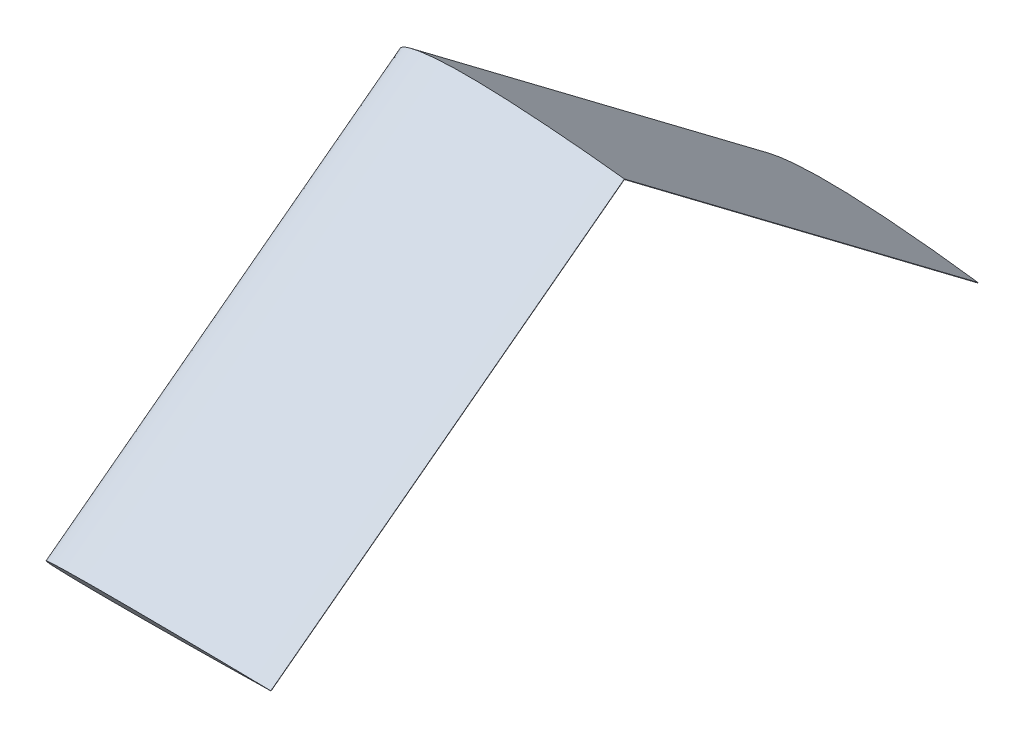
ISO-10303-21;
HEADER;
FILE_DESCRIPTION(('STEP AP214'),'2;1');
FILE_NAME('part.step','',(''),(''),'','','');
FILE_SCHEMA(('AUTOMOTIVE_DESIGN { 1 0 10303 214 1 1 1 1 }'));
ENDSEC;
DATA;
#1=APPLICATION_CONTEXT('core data for automotive mechanical design processes');
#2=APPLICATION_PROTOCOL_DEFINITION('international standard','automotive_design',2000,#1);
#3=PRODUCT_CONTEXT('',#1,'mechanical');
#4=PRODUCT('Part','Part','',(#3));
#5=PRODUCT_RELATED_PRODUCT_CATEGORY('part','',(#4));
#6=PRODUCT_DEFINITION_FORMATION('','',#4);
#7=PRODUCT_DEFINITION_CONTEXT('part definition',#1,'design');
#8=PRODUCT_DEFINITION('design','',#6,#7);
#9=PRODUCT_DEFINITION_SHAPE('','',#8);
#10=(LENGTH_UNIT() NAMED_UNIT(*) SI_UNIT(.MILLI.,.METRE.));
#11=(NAMED_UNIT(*) PLANE_ANGLE_UNIT() SI_UNIT($,.RADIAN.));
#12=(NAMED_UNIT(*) SI_UNIT($,.STERADIAN.) SOLID_ANGLE_UNIT());
#13=UNCERTAINTY_MEASURE_WITH_UNIT(LENGTH_MEASURE(1.E-05),#10,'distance_accuracy_value','');
#14=(GEOMETRIC_REPRESENTATION_CONTEXT(3) GLOBAL_UNCERTAINTY_ASSIGNED_CONTEXT((#13)) GLOBAL_UNIT_ASSIGNED_CONTEXT((#10,
#11,#12)) REPRESENTATION_CONTEXT('',''));
#15=CARTESIAN_POINT('',(0.,0.,0.));
#16=DIRECTION('',(0.,0.,1.));
#17=DIRECTION('',(1.,0.,0.));
#18=AXIS2_PLACEMENT_3D('',#15,#16,#17);
#19=CARTESIAN_POINT('',(143.952602362274,-161.848092926006,378.892977336685));
#20=CARTESIAN_POINT('',(140.61957999214,-161.604115399992,379.076827589547));
#21=CARTESIAN_POINT('',(133.954991813125,-161.116266968375,379.444447751029));
#22=CARTESIAN_POINT('',(120.62372160465,-160.207856944438,380.128983803721));
#23=CARTESIAN_POINT('',(103.959189074714,-159.165298958326,380.914607596622));
#24=CARTESIAN_POINT('',(83.9586002291853,-158.056392438793,381.750228595601));
#25=CARTESIAN_POINT('',(63.9588116130858,-157.091822782139,382.477083966979));
#26=CARTESIAN_POINT('',(43.9586195633446,-156.308534669504,383.067333896653));
#27=CARTESIAN_POINT('',(23.9577994776588,-155.748200364287,383.489576081761));
#28=CARTESIAN_POINT('',(3.95194559722353,-155.513754885242,383.666243422023));
#29=CARTESIAN_POINT('',(-12.7217349486802,-155.70661131207,383.520915680499));
#30=CARTESIAN_POINT('',(-26.0606713748085,-156.244088382626,383.115897657144));
#31=CARTESIAN_POINT('',(-34.3930295079639,-156.810856651528,382.688807132643));
#32=CARTESIAN_POINT('',(-41.0692888617203,-157.487508912649,382.178913080764));
#33=CARTESIAN_POINT('',(-46.0602083374664,-158.142946372311,381.685005528447));
#34=CARTESIAN_POINT('',(-50.3481449580584,-158.998680431969,381.040163661981));
#35=CARTESIAN_POINT('',(-53.7165706322389,-159.872289036431,380.381852359884));
#36=CARTESIAN_POINT('',(-57.3766252059797,-161.982263691694,378.791872412796));
#37=CARTESIAN_POINT('',(-53.7165706322388,-164.092238346958,377.201892465707));
#38=CARTESIAN_POINT('',(-50.3481449580584,-164.96584695142,376.54358116361));
#39=CARTESIAN_POINT('',(-46.0602083374664,-165.821581011078,375.898739297144));
#40=CARTESIAN_POINT('',(-41.0692888617202,-166.477018470739,375.404831744827));
#41=CARTESIAN_POINT('',(-34.393029507964,-167.15367073186,374.894937692948));
#42=CARTESIAN_POINT('',(-26.0606713748085,-167.720439000762,374.467847168448));
#43=CARTESIAN_POINT('',(-12.7217349486803,-168.257916071319,374.062829145092));
#44=CARTESIAN_POINT('',(3.95194559722356,-168.450772498147,373.917501403568));
#45=CARTESIAN_POINT('',(23.9577994776588,-168.216327019102,374.09416874383));
#46=CARTESIAN_POINT('',(43.9586195633446,-167.655992713885,374.516410928938));
#47=CARTESIAN_POINT('',(63.9588116130858,-166.87270460125,375.106660858612));
#48=CARTESIAN_POINT('',(83.9586002291853,-165.908134944596,375.83351622999));
#49=CARTESIAN_POINT('',(103.959189074714,-164.799228425063,376.669137228969));
#50=CARTESIAN_POINT('',(120.62372160465,-163.756670438951,377.45476102187));
#51=CARTESIAN_POINT('',(133.954991813125,-162.848260415014,378.139297074562));
#52=CARTESIAN_POINT('',(140.61957999214,-162.360411983396,378.506917236044));
#53=CARTESIAN_POINT('',(143.952602362274,-162.116434457382,378.690767488906));
#54=B_SPLINE_CURVE_WITH_KNOTS('',3,(#19,#20,#21,#22,#23,#24,#25,#26,#27,#28,#29,#30,#31,#32,#33,
#34,#35,#36,#37,#38,#39,#40,#41,#42,#43,#44,#45,#46,#47,#48,#49,#50,#51,#52,#53),.UNSPECIFIED.,
.F.,.F.,(4,1,1,1,1,1,1,1,1,1,1,1,1,1,1,1,1,1,1,1,1,1,1,1,1,1,1,1,1,1,1,1,4),(0.,
0.0248762929189861,0.0497417146704997,0.099443402111095,0.149112224036195,0.198750974066913,
0.248359097492202,0.297937369716024,0.347491327096237,0.39705092368842,0.421859474838904,
0.446731345826761,0.459220451479858,0.471790601601357,0.484560454432956,0.491195112481227,0.5,
0.508804887518773,0.515439545567044,0.528209398398643,0.540779548520142,0.553268654173239,
0.578140525161096,0.60294907631158,0.652508672903763,0.702062630283976,0.751640902507798,
0.801249025933087,0.850887775963805,0.900556597888905,0.9502582853295,0.975123707081014,1.),.UNSPECIFIED.);
#55=DIRECTION('',(0.,0.601815023152049,-0.798635510047292));
#56=VECTOR('',#55,1.);
#57=SURFACE_OF_LINEAR_EXTRUSION('',#54,#56);
#58=DIRECTION('',(0.,0.601815023152049,-0.798635510047292));
#59=VECTOR('',#58,1.);
#60=CARTESIAN_POINT('',(143.952602362274,-161.848092926006,378.892977336685));
#61=LINE('',#60,#59);
#62=CARTESIAN_POINT('',(143.952602362274,-161.848092926006,378.892977336685));
#63=VERTEX_POINT('',#62);
#64=CARTESIAN_POINT('',(143.952602362274,75.3250829326901,64.153542486136));
#65=VERTEX_POINT('',#64);
#66=EDGE_CURVE('E45',#63,#65,#61,.T.);
#67=ORIENTED_EDGE('',*,*,#66,.T.);
#68=CARTESIAN_POINT('',(143.952602362274,75.3250829326901,64.153542486136));
#69=CARTESIAN_POINT('',(143.091504842635,75.4239090445904,64.153542486136));
#70=CARTESIAN_POINT('',(142.230406919768,75.5227334980247,64.153542486136));
#71=CARTESIAN_POINT('',(140.508157930398,75.7199322641916,64.153542486136));
#72=CARTESIAN_POINT('',(139.647006863799,75.8183065760767,64.153542486136));
#73=CARTESIAN_POINT('',(137.924602775179,76.0141578276672,64.153542486136));
#74=CARTESIAN_POINT('',(137.063349753193,76.1116347676696,64.153542486136));
#75=CARTESIAN_POINT('',(135.340690800568,76.3052232311979,64.153542486136));
#76=CARTESIAN_POINT('',(134.479284870057,76.4013347558591,64.153542486136));
#77=CARTESIAN_POINT('',(131.892725055203,76.6872706822147,64.153542486136));
#78=CARTESIAN_POINT('',(130.167279474345,76.874461337291,64.153542486136));
#79=CARTESIAN_POINT('',(126.715755907748,77.24289792046,64.153542486136));
#80=CARTESIAN_POINT('',(124.989677922064,77.4241438490792,64.153542486136));
#81=CARTESIAN_POINT('',(121.535353633618,77.7816932027243,64.153542486136));
#82=CARTESIAN_POINT('',(119.807106828285,77.9579917709669,64.153542486136));
#83=CARTESIAN_POINT('',(116.350098179853,78.3054677751467,64.153542486136));
#84=CARTESIAN_POINT('',(114.621336336655,78.4766452100797,64.153542486136));
#85=CARTESIAN_POINT('',(111.162096219548,78.8140637137569,64.153542486136));
#86=CARTESIAN_POINT('',(109.431617596559,78.9803012046796,64.153542486136));
#87=CARTESIAN_POINT('',(105.970187570763,79.3077672476626,64.153542486136));
#88=CARTESIAN_POINT('',(104.239236168019,79.468995800409,64.153542486136));
#89=CARTESIAN_POINT('',(99.044099308192,79.9453671176224,64.153542486136));
#90=CARTESIAN_POINT('',(95.5792244273077,80.2530402098719,64.153542486136));
#91=CARTESIAN_POINT('',(90.3802474315717,80.6994746457596,64.153542486136));
#92=CARTESIAN_POINT('',(88.6467895595026,80.8457886414351,64.153542486136));
#93=CARTESIAN_POINT('',(85.1794555059264,81.1333849586469,64.153542486136));
#94=CARTESIAN_POINT('',(83.4455793243787,81.2746672796919,64.153542486136));
#95=CARTESIAN_POINT('',(79.9394818342838,81.5550764273189,64.153542486136));
#96=CARTESIAN_POINT('',(78.1672513455697,81.6940885116319,64.153542486136));
#97=CARTESIAN_POINT('',(74.6223430595246,81.9662921225997,64.153542486136));
#98=CARTESIAN_POINT('',(72.8496652622246,82.0994836496566,64.153542486136));
#99=CARTESIAN_POINT('',(69.3042081426059,82.3596607187556,64.153542486136));
#100=CARTESIAN_POINT('',(67.5314289104969,82.4866474890378,64.153542486136));
#101=CARTESIAN_POINT('',(63.9854135078099,82.7340781184585,64.153542486136));
#102=CARTESIAN_POINT('',(62.2121773372542,82.8545219779159,64.153542486136));
#103=CARTESIAN_POINT('',(58.6659397194216,83.0884204192505,64.153542486136));
#104=CARTESIAN_POINT('',(56.8929384513298,83.2018777147307,64.153542486136));
#105=CARTESIAN_POINT('',(53.3464795567983,83.4214372461215,64.153542486136));
#106=CARTESIAN_POINT('',(51.5730219302596,83.5275394804364,64.153542486136));
#107=CARTESIAN_POINT('',(48.0266555121979,83.7319077705604,64.153542486136));
#108=CARTESIAN_POINT('',(46.2537469729836,83.8301782000895,64.153542486136));
#109=CARTESIAN_POINT('',(42.7074960717293,84.0185645962361,64.153542486136));
#110=CARTESIAN_POINT('',(40.9341537097865,84.1086805646786,64.153542486136));
#111=CARTESIAN_POINT('',(37.3882707735612,84.2797230785456,64.153542486136));
#112=CARTESIAN_POINT('',(35.6157305093444,84.3606560252196,64.153542486136));
#113=CARTESIAN_POINT('',(32.0702120413599,84.5123718261132,64.153542486136));
#114=CARTESIAN_POINT('',(30.2972338371881,84.5831546709358,64.153542486136));
#115=CARTESIAN_POINT('',(26.7522354834228,84.71351280535,64.153542486136));
#116=CARTESIAN_POINT('',(24.9802156522872,84.7730967137726,64.153542486136));
#117=CARTESIAN_POINT('',(21.4358113814512,84.8800667513362,64.153542486136));
#118=CARTESIAN_POINT('',(19.6634269431417,84.9274529261755,64.153542486136));
#119=CARTESIAN_POINT('',(16.1301031642667,85.0083539719661,64.153542486136));
#120=CARTESIAN_POINT('',(14.3691659005415,85.0419587808441,64.153542486136));
#121=CARTESIAN_POINT('',(10.8469376379321,85.0944052089932,64.153542486136));
#122=CARTESIAN_POINT('',(9.08564662269794,85.1132457637078,64.153542486136));
#123=CARTESIAN_POINT('',(6.44316283663508,85.1294075319724,64.153542486136));
#124=CARTESIAN_POINT('',(5.56200423064849,85.1327775476692,64.153542486136));
#125=CARTESIAN_POINT('',(3.79968018386539,85.1353278281197,64.153542486136));
#126=CARTESIAN_POINT('',(2.91851474306882,85.1345080928318,64.153542486136));
#127=CARTESIAN_POINT('',(1.15528851349806,85.1283619546332,64.153542486136));
#128=CARTESIAN_POINT('',(0.273227739822705,85.1230308986157,64.153542486136));
#129=CARTESIAN_POINT('',(-1.49084911613677,85.1074831447258,64.153542486136));
#130=CARTESIAN_POINT('',(-2.37286519842429,85.097266447226,64.153542486136));
#131=CARTESIAN_POINT('',(-5.0215640126559,85.0587090559856,64.153542486136));
#132=CARTESIAN_POINT('',(-6.7881456363967,85.0224683668577,64.153542486136));
#133=CARTESIAN_POINT('',(-9.43941992083861,84.9501005715352,64.153542486136));
#134=CARTESIAN_POINT('',(-10.3243647828136,84.9229378826865,64.153542486136));
#135=CARTESIAN_POINT('',(-12.0940388078164,84.8622349551788,64.153542486136));
#136=CARTESIAN_POINT('',(-12.9787679706973,84.828694712187,64.153542486136));
#137=CARTESIAN_POINT('',(-14.7477165068682,84.7549012254339,64.153542486136));
#138=CARTESIAN_POINT('',(-15.6319359528791,84.7146497270809,64.153542486136));
#139=CARTESIAN_POINT('',(-17.4000227725327,84.6270046362215,64.153542486136));
#140=CARTESIAN_POINT('',(-18.2838901462076,84.5796110443714,64.153542486136));
#141=CARTESIAN_POINT('',(-20.0515146071349,84.476815943843,64.153542486136));
#142=CARTESIAN_POINT('',(-20.9352715100331,84.421411251097,64.153542486136));
#143=CARTESIAN_POINT('',(-22.7021939728894,84.3018110382037,64.153542486136));
#144=CARTESIAN_POINT('',(-23.5853595335455,84.237615528452,64.153542486136));
#145=CARTESIAN_POINT('',(-24.9090305304399,84.1341589068031,64.153542486136));
#146=CARTESIAN_POINT('',(-25.3498194787281,84.0985022103079,64.153542486136));
#147=CARTESIAN_POINT('',(-26.2311876041704,84.0247013487188,64.153542486136));
#148=CARTESIAN_POINT('',(-26.6717667819209,83.9865571907396,64.153542486136));
#149=CARTESIAN_POINT('',(-27.9931567311891,83.8681219968155,64.153542486136));
#150=CARTESIAN_POINT('',(-28.8736142415541,83.7838286804741,64.153542486136));
#151=CARTESIAN_POINT('',(-30.6311195513557,83.6032487307955,64.153542486136));
#152=CARTESIAN_POINT('',(-31.5081704169792,83.5069920234199,64.153542486136));
#153=CARTESIAN_POINT('',(-33.2606722816216,83.3008283693725,64.153542486136));
#154=CARTESIAN_POINT('',(-34.1361232953858,83.1909215491587,64.153542486136));
#155=CARTESIAN_POINT('',(-35.4463391850807,83.014940385316,64.153542486136));
#156=CARTESIAN_POINT('',(-35.8818704403477,82.9545349484617,64.153542486136));
#157=CARTESIAN_POINT('',(-36.7523664925758,82.8297836602434,64.153542486136));
#158=CARTESIAN_POINT('',(-37.1873312941877,82.7654378414425,64.153542486136));
#159=CARTESIAN_POINT('',(-38.0566705767303,82.6324752162049,64.153542486136));
#160=CARTESIAN_POINT('',(-38.4910449663368,82.5638578121717,64.153542486136));
#161=CARTESIAN_POINT('',(-39.3590511630824,82.4220494422724,64.153542486136));
#162=CARTESIAN_POINT('',(-39.7926829664721,82.3488584533833,64.153542486136));
#163=CARTESIAN_POINT('',(-40.4419600264255,82.2354791516525,64.153542486136));
#164=CARTESIAN_POINT('',(-40.6579285553256,82.1971360732949,64.153542486136));
#165=CARTESIAN_POINT('',(-41.0896403279291,82.11920247366,64.153542486136));
#166=CARTESIAN_POINT('',(-41.3053835714709,82.079611951488,64.153542486136));
#167=CARTESIAN_POINT('',(-41.9522212540842,81.9587053097464,64.153542486136));
#168=CARTESIAN_POINT('',(-42.3829211672392,81.8752545443628,64.153542486136));
#169=CARTESIAN_POINT('',(-43.2427340032819,81.7010252338525,64.153542486136));
#170=CARTESIAN_POINT('',(-43.6718472883149,81.6102484846794,64.153542486136));
#171=CARTESIAN_POINT('',(-44.5281024795138,81.4198685770225,64.153542486136));
#172=CARTESIAN_POINT('',(-44.9552444904368,81.3202658933828,64.153542486136));
#173=CARTESIAN_POINT('',(-45.6391089420976,81.1521773026259,64.153542486136));
#174=CARTESIAN_POINT('',(-45.8966234787967,81.0869062477102,64.153542486136));
#175=CARTESIAN_POINT('',(-46.4107356127852,80.9523994835194,64.153542486136));
#176=CARTESIAN_POINT('',(-46.6673327639319,80.8831620669524,64.153542486136));
#177=CARTESIAN_POINT('',(-47.1796991919164,80.7407931775547,64.153542486136));
#178=CARTESIAN_POINT('',(-47.4354674849489,80.667658166386,64.153542486136));
#179=CARTESIAN_POINT('',(-47.9462419156183,80.5174668715224,64.153542486136));
#180=CARTESIAN_POINT('',(-48.2012464699879,80.4404052038941,64.153542486136));
#181=CARTESIAN_POINT('',(-48.7105457979869,80.2822822225644,64.153542486136));
#182=CARTESIAN_POINT('',(-48.9648383006953,80.2012135838178,64.153542486136));
#183=CARTESIAN_POINT('',(-49.3438296208438,80.0771353414723,64.153542486136));
#184=CARTESIAN_POINT('',(-49.4690181223648,80.0356163290272,64.153542486136));
#185=CARTESIAN_POINT('',(-49.719065641439,79.9515986144812,64.153542486136));
#186=CARTESIAN_POINT('',(-49.8439246605605,79.9090999170527,64.153542486136));
#187=CARTESIAN_POINT('',(-50.0933140180802,79.8231005409698,64.153542486136));
#188=CARTESIAN_POINT('',(-50.2178443149123,79.7795997417871,64.153542486136));
#189=CARTESIAN_POINT('',(-50.4665429612923,79.6915715654654,64.153542486136));
#190=CARTESIAN_POINT('',(-50.5907113077087,79.6470441794744,64.153542486136));
#191=CARTESIAN_POINT('',(-50.838488493365,79.557025770829,64.153542486136));
#192=CARTESIAN_POINT('',(-50.9620978904113,79.5115362817313,64.153542486136));
#193=CARTESIAN_POINT('',(-51.2088933948002,79.4194101874438,64.153542486136));
#194=CARTESIAN_POINT('',(-51.3320794958394,79.3727735652553,64.153542486136));
#195=CARTESIAN_POINT('',(-51.5772200896587,79.2772991006177,64.153542486136));
#196=CARTESIAN_POINT('',(-51.6991770144063,79.2284675616305,64.153542486136));
#197=CARTESIAN_POINT('',(-51.9417300550992,79.1275257413686,64.153542486136));
#198=CARTESIAN_POINT('',(-52.0623262228257,79.0754155853555,64.153542486136));
#199=CARTESIAN_POINT('',(-52.3015742602238,78.9672378121424,64.153542486136));
#200=CARTESIAN_POINT('',(-52.4202281961954,78.9111747901135,64.153542486136));
#201=CARTESIAN_POINT('',(-52.6553352785154,78.7946180996915,64.153542486136));
#202=CARTESIAN_POINT('',(-52.7717885034972,78.7341245899818,64.153542486136));
#203=CARTESIAN_POINT('',(-53.0432741183173,78.5861694054344,64.153542486136));
#204=CARTESIAN_POINT('',(-53.1972644111348,78.4967801151391,64.153542486136));
#205=CARTESIAN_POINT('',(-53.4245390220594,78.3566098003706,64.153542486136));
#206=CARTESIAN_POINT('',(-53.4997078690134,78.3088517883278,64.153542486136));
#207=CARTESIAN_POINT('',(-53.6487865953405,78.2114051395005,64.153542486136));
#208=CARTESIAN_POINT('',(-53.7226964426265,78.1617164536158,64.153542486136));
#209=CARTESIAN_POINT('',(-53.9425968225125,78.0096658829484,64.153542486136));
#210=CARTESIAN_POINT('',(-54.0866055110525,77.9044136526297,64.153542486136));
#211=CARTESIAN_POINT('',(-54.3683227215342,77.6858576662072,64.153542486136));
#212=CARTESIAN_POINT('',(-54.5060338122773,77.5725572420082,64.153542486136));
#213=CARTESIAN_POINT('',(-54.7292462225555,77.3759016300992,64.153542486136));
#214=CARTESIAN_POINT('',(-54.8169460072559,77.2950423289404,64.153542486136));
#215=CARTESIAN_POINT('',(-54.9879968191381,77.1288606370401,64.153542486136));
#216=CARTESIAN_POINT('',(-55.0713488772023,77.0435393139781,64.153542486136));
#217=CARTESIAN_POINT('',(-55.2325130662353,76.8680416722088,64.153542486136));
#218=CARTESIAN_POINT('',(-55.3103341947127,76.7778736780924,64.153542486136));
#219=CARTESIAN_POINT('',(-55.4589945860398,76.591999924668,64.153542486136));
#220=CARTESIAN_POINT('',(-55.5298383982001,76.4962978391533,64.1535424861359));
#221=CARTESIAN_POINT('',(-55.6673894410979,76.2911841540217,64.1535424861359));
#222=CARTESIAN_POINT('',(-55.7333797329425,76.1812830521377,64.153542486136));
#223=CARTESIAN_POINT('',(-55.8506517045267,75.9537794715797,64.153542486136));
#224=CARTESIAN_POINT('',(-55.9019454040337,75.8361833835933,64.153542486136));
#225=CARTESIAN_POINT('',(-55.97597620075,75.6175041982206,64.153542486136));
#226=CARTESIAN_POINT('',(-56.0023376737124,75.517694375028,64.153542486136));
#227=CARTESIAN_POINT('',(-56.0292393607463,75.3658823664578,64.153542486136));
#228=CARTESIAN_POINT('',(-56.0360993443303,75.3149742914742,64.153542486136));
#229=CARTESIAN_POINT('',(-56.0452464387317,75.2127432516913,64.153542486136));
#230=CARTESIAN_POINT('',(-56.047534613886,75.1614203862513,64.1535424861359));
#231=CARTESIAN_POINT('',(-56.0472471580087,75.0586428490093,64.1535424861359));
#232=CARTESIAN_POINT('',(-56.044657750578,75.0071882150238,64.153542486136));
#233=CARTESIAN_POINT('',(-56.0349070915986,74.9047043673854,64.153542486136));
#234=CARTESIAN_POINT('',(-56.0277431853434,74.8536754182007,64.153542486136));
#235=CARTESIAN_POINT('',(-55.9999332346724,74.701551415175,64.153542486136));
#236=CARTESIAN_POINT('',(-55.9729715125178,74.6015728539683,64.153542486136));
#237=CARTESIAN_POINT('',(-55.9138451416059,74.429710457099,64.153542486136));
#238=CARTESIAN_POINT('',(-55.8844567812057,74.3568149306114,64.153542486136));
#239=CARTESIAN_POINT('',(-55.8193890129286,74.2138438015702,64.153542486136));
#240=CARTESIAN_POINT('',(-55.783705936014,74.1437698730767,64.153542486136));
#241=CARTESIAN_POINT('',(-55.7071345748009,74.0063304484578,64.153542486136));
#242=CARTESIAN_POINT('',(-55.6662334453048,73.9389721949748,64.153542486136));
#243=CARTESIAN_POINT('',(-55.5802154269054,73.8069935869013,64.153542486136));
#244=CARTESIAN_POINT('',(-55.5350972130566,73.7423741021225,64.153542486136));
#245=CARTESIAN_POINT('',(-55.4259688141894,73.5948744101349,64.153542486136));
#246=CARTESIAN_POINT('',(-55.3606271294481,73.512981617898,64.153542486136));
#247=CARTESIAN_POINT('',(-55.2250599278193,73.3532699386011,64.153542486136));
#248=CARTESIAN_POINT('',(-55.1548305324397,73.2754543747312,64.153542486136));
#249=CARTESIAN_POINT('',(-55.0104384484415,73.1235437920001,64.153542486136));
#250=CARTESIAN_POINT('',(-54.9362748147799,73.0494496754648,64.153542486136));
#251=CARTESIAN_POINT('',(-54.7847212505564,72.9046737505047,64.153542486136));
#252=CARTESIAN_POINT('',(-54.70733176029,72.8339914792226,64.153542486136));
#253=CARTESIAN_POINT('',(-54.5498472181498,72.6957780960501,64.153542486136));
#254=CARTESIAN_POINT('',(-54.469753194931,72.6282458088427,64.1535424861359));
#255=CARTESIAN_POINT('',(-54.3071736296893,72.4960670665234,64.153542486136));
#256=CARTESIAN_POINT('',(-54.2246871747985,72.4314217375174,64.1535424861361));
#257=CARTESIAN_POINT('',(-54.0277447705784,72.2822602123031,64.1535424861361));
#258=CARTESIAN_POINT('',(-53.9124068877257,72.1989070151379,64.153542486136));
#259=CARTESIAN_POINT('',(-53.6783189366077,72.0370474173846,64.1535424861359));
#260=CARTESIAN_POINT('',(-53.5595675314954,71.9585429546857,64.153542486136));
#261=CARTESIAN_POINT('',(-53.3189031160552,71.8065972069062,64.153542486136));
#262=CARTESIAN_POINT('',(-53.1969908603278,71.7331547284023,64.153542486136));
#263=CARTESIAN_POINT('',(-52.9501994875512,71.5916812992463,64.153542486136));
#264=CARTESIAN_POINT('',(-52.8253229142801,71.5236459121309,64.153542486136));
#265=CARTESIAN_POINT('',(-52.5723612527515,71.3926647537397,64.153542486136));
#266=CARTESIAN_POINT('',(-52.4442661996192,71.3297382657053,64.153542486136));
#267=CARTESIAN_POINT('',(-52.1857471877617,71.2088570348012,64.153542486136));
#268=CARTESIAN_POINT('',(-52.0553230057184,71.1509027717969,64.153542486136));
#269=CARTESIAN_POINT('',(-51.7926212526764,71.0391158024678,64.153542486136));
#270=CARTESIAN_POINT('',(-51.6603424072996,70.9852861127765,64.153542486136));
#271=CARTESIAN_POINT('',(-51.4610161511027,70.9067527176867,64.153542486136));
#272=CARTESIAN_POINT('',(-51.3944019068255,70.8809357691287,64.153542486136));
#273=CARTESIAN_POINT('',(-51.2609532617509,70.8298741081267,64.153542486136));
#274=CARTESIAN_POINT('',(-51.1941188578632,70.8046294037545,64.153542486136));
#275=CARTESIAN_POINT('',(-51.0506071504989,70.7508756197378,64.153542486136));
#276=CARTESIAN_POINT('',(-50.9739083276988,70.7224241915159,64.153542486136));
#277=CARTESIAN_POINT('',(-50.8203654775441,70.6659156372095,64.153542486136));
#278=CARTESIAN_POINT('',(-50.7435214500409,70.6378585115292,64.153542486136));
#279=CARTESIAN_POINT('',(-50.5127687025046,70.5542938409144,64.153542486136));
#280=CARTESIAN_POINT('',(-50.3586400331744,70.4993932701514,64.153542486136));
#281=CARTESIAN_POINT('',(-49.8954262112763,70.3370179014985,64.153542486136));
#282=CARTESIAN_POINT('',(-49.5855218043469,70.2318726424985,64.153542486136));
#283=CARTESIAN_POINT('',(-48.9637534995057,70.0275190322083,64.153542486136));
#284=CARTESIAN_POINT('',(-48.6518895310898,69.9283108959005,64.153542486136));
#285=CARTESIAN_POINT('',(-48.0263758060117,69.735689794795,64.153542486136));
#286=CARTESIAN_POINT('',(-47.7127260393789,69.6422768623879,64.153542486136));
#287=CARTESIAN_POINT('',(-47.0837089158528,69.4612080785802,64.153542486136));
#288=CARTESIAN_POINT('',(-46.7683412746777,69.3735532134557,64.153542486136));
#289=CARTESIAN_POINT('',(-46.2941109883373,69.2464865268156,64.153542486136));
#290=CARTESIAN_POINT('',(-46.1358371551145,69.2048667508384,64.153542486136));
#291=CARTESIAN_POINT('',(-45.8189046683789,69.1231163391731,64.153542486136));
#292=CARTESIAN_POINT('',(-45.6602460133246,69.0829857094605,64.153542486136));
#293=CARTESIAN_POINT('',(-45.1837155140361,68.9647264812723,64.153542486136));
#294=CARTESIAN_POINT('',(-44.8653111229623,68.8887364211902,64.153542486136));
#295=CARTESIAN_POINT('',(-44.227312858038,68.7419427236472,64.153542486136));
#296=CARTESIAN_POINT('',(-43.9077189783501,68.6711391116743,64.153542486136));
#297=CARTESIAN_POINT('',(-43.2662304466943,68.5338427816301,64.153542486136));
#298=CARTESIAN_POINT('',(-42.9443317419105,68.4673690475577,64.153542486136));
#299=CARTESIAN_POINT('',(-42.2997371585009,68.3384190912528,64.153542486136));
#300=CARTESIAN_POINT('',(-41.9770412782564,68.2759428771445,64.153542486136));
#301=CARTESIAN_POINT('',(-41.3311046336845,68.1542688576356,64.153542486136));
#302=CARTESIAN_POINT('',(-41.0078639981014,68.0950703661052,64.153542486136));
#303=CARTESIAN_POINT('',(-40.3608915549719,67.9794288559995,64.153542486136));
#304=CARTESIAN_POINT('',(-40.0371597482664,67.9229858327118,64.153542486136));
#305=CARTESIAN_POINT('',(-39.3892548461898,67.8127801562698,64.153542486136));
#306=CARTESIAN_POINT('',(-39.0650817706884,67.7590173862781,64.153542486136));
#307=CARTESIAN_POINT('',(-38.4163279895494,67.6540197369659,64.153542486136));
#308=CARTESIAN_POINT('',(-38.091747284705,67.6027848527352,64.153542486136));
#309=CARTESIAN_POINT('',(-37.1174795308948,67.4526768669543,64.153542486136));
#310=CARTESIAN_POINT('',(-36.4672373539867,67.3573954426719,64.153542486136));
#311=CARTESIAN_POINT('',(-34.9534250016652,67.1457778828665,64.153542486136));
#312=CARTESIAN_POINT('',(-34.0893998397032,67.032701076912,64.153542486136));
#313=CARTESIAN_POINT('',(-32.3596472069321,66.820321630238,64.153542486136));
#314=CARTESIAN_POINT('',(-31.4939196976698,66.7210193043723,64.153542486136));
#315=CARTESIAN_POINT('',(-29.7610917655512,66.5347569702205,64.153542486136));
#316=CARTESIAN_POINT('',(-28.8939912627879,66.4477977091499,64.153542486136));
#317=CARTESIAN_POINT('',(-27.1587802001027,66.2847363547585,64.153542486136));
#318=CARTESIAN_POINT('',(-26.2906696445434,66.2086342147185,64.153542486136));
#319=CARTESIAN_POINT('',(-24.5532927667184,66.0659226873709,64.153542486136));
#320=CARTESIAN_POINT('',(-23.6840261062775,65.9993174363,64.153542486136));
#321=CARTESIAN_POINT('',(-21.9448640608879,65.8749375689189,64.153542486136));
#322=CARTESIAN_POINT('',(-21.0749686763579,65.8171629467315,64.153542486136));
#323=CARTESIAN_POINT('',(-19.3343242872876,65.7096432620345,64.153542486136));
#324=CARTESIAN_POINT('',(-18.4635750786586,65.6599015208652,64.153542486136));
#325=CARTESIAN_POINT('',(-16.7216940117845,65.567670488203,64.153542486136));
#326=CARTESIAN_POINT('',(-15.8505621531933,65.5251812032829,64.153542486136));
#327=CARTESIAN_POINT('',(-14.1078243829506,65.4468410940983,64.153542486136));
#328=CARTESIAN_POINT('',(-13.2362184110779,65.4109916129892,64.153542486136));
#329=CARTESIAN_POINT('',(-11.4927711398355,65.3456432051477,64.153542486136));
#330=CARTESIAN_POINT('',(-10.6209298407033,65.3161442720325,64.153542486136));
#331=CARTESIAN_POINT('',(-8.00530412011786,65.2366422312909,64.153542486136));
#332=CARTESIAN_POINT('',(-6.26124159708381,65.1956260979165,64.153542486136));
#333=CARTESIAN_POINT('',(-2.77458075541047,65.1348134438956,64.153542486136));
#334=CARTESIAN_POINT('',(-1.03198280552638,65.1149948490044,64.153542486136));
#335=CARTESIAN_POINT('',(1.58165085811895,65.099044536561,64.153542486136));
#336=CARTESIAN_POINT('',(2.45265148575412,65.0960232896794,64.153542486136));
#337=CARTESIAN_POINT('',(4.19465725139902,65.0942041474645,64.153542486136));
#338=CARTESIAN_POINT('',(5.06566238940912,65.0954062524925,64.153542486136));
#339=CARTESIAN_POINT('',(7.67821280527559,65.1050483335209,64.153542486136));
#340=CARTESIAN_POINT('',(9.41973844775483,65.1195216036573,64.153542486136));
#341=CARTESIAN_POINT('',(12.9023320898812,65.1632717344574,64.153542486136));
#342=CARTESIAN_POINT('',(14.6434001188389,65.1925463415707,64.153542486136));
#343=CARTESIAN_POINT('',(18.1251299675441,65.2645904328426,64.153542486136));
#344=CARTESIAN_POINT('',(19.8657918074093,65.3073589541477,64.153542486136));
#345=CARTESIAN_POINT('',(23.346757843303,65.4050504524324,64.1535424861359));
#346=CARTESIAN_POINT('',(25.0870620420052,65.4599733349703,64.1535424861359));
#347=CARTESIAN_POINT('',(28.4638288335067,65.5772653345018,64.1535424861359));
#348=CARTESIAN_POINT('',(30.1003136930728,65.6389976106136,64.1535424861359));
#349=CARTESIAN_POINT('',(33.3729218776215,65.7714519907568,64.153542486136));
#350=CARTESIAN_POINT('',(35.0090452018136,65.8421741142556,64.153542486136));
#351=CARTESIAN_POINT('',(38.2810857660997,65.991819260755,64.153542486136));
#352=CARTESIAN_POINT('',(39.9170029670842,66.0707431355913,64.153542486136));
#353=CARTESIAN_POINT('',(43.1884644940648,66.2359387090841,64.153542486136));
#354=CARTESIAN_POINT('',(44.8240088202162,66.3222104046754,64.153542486136));
#355=CARTESIAN_POINT('',(48.0949407976248,66.5015556195402,64.153542486136));
#356=CARTESIAN_POINT('',(49.7303283996706,66.5946300355259,64.153542486136));
#357=CARTESIAN_POINT('',(53.000718685505,66.7872921554209,64.153542486136));
#358=CARTESIAN_POINT('',(54.6357213693388,66.8868798585646,64.153542486136));
#359=CARTESIAN_POINT('',(59.5405436151687,67.1949253467566,64.153542486136));
#360=CARTESIAN_POINT('',(62.8097845120938,67.4126438138789,64.153542486136));
#361=CARTESIAN_POINT('',(69.3470128145788,67.870252192513,64.153542486136));
#362=CARTESIAN_POINT('',(72.6150000749957,68.110144167564,64.153542486136));
#363=CARTESIAN_POINT('',(77.5159150346946,68.484905797706,64.153542486136));
#364=CARTESIAN_POINT('',(79.1494171119687,68.6123170394505,64.153542486136));
#365=CARTESIAN_POINT('',(82.4160511944413,68.8718045582739,64.153542486136));
#366=CARTESIAN_POINT('',(84.0491831996112,69.0038808357124,64.153542486136));
#367=CARTESIAN_POINT('',(87.3038640442138,69.2715768649717,64.153542486136));
#368=CARTESIAN_POINT('',(88.9254153995898,69.4071660485979,64.153542486136));
#369=CARTESIAN_POINT('',(92.1681428551381,69.6827589089944,64.153542486136));
#370=CARTESIAN_POINT('',(93.7893189553423,69.8227625853868,64.153542486136));
#371=CARTESIAN_POINT('',(97.0312046610358,70.1071519446011,64.153542486136));
#372=CARTESIAN_POINT('',(98.6519142858666,70.2515374069651,64.153542486136));
#373=CARTESIAN_POINT('',(101.892938322312,70.5446771365638,64.153542486136));
#374=CARTESIAN_POINT('',(103.513252733941,70.6934314036405,64.153542486136));
#375=CARTESIAN_POINT('',(106.753273302954,70.9952840167601,64.153542486136));
#376=CARTESIAN_POINT('',(108.372979510964,71.1483818193672,64.153542486136));
#377=CARTESIAN_POINT('',(111.611969365097,71.4589878141239,64.153542486136));
#378=CARTESIAN_POINT('',(113.231253011137,71.6164960071501,64.153542486136));
#379=CARTESIAN_POINT('',(116.469059270406,71.9359368578655,64.153542486136));
#380=CARTESIAN_POINT('',(118.0875819709,72.097868630975,64.153542486136));
#381=CARTESIAN_POINT('',(121.324172013276,72.4262151258888,64.153542486136));
#382=CARTESIAN_POINT('',(122.942239355317,72.592629846111,64.153542486136));
#383=CARTESIAN_POINT('',(126.177463207842,72.9299979257603,64.153542486136));
#384=CARTESIAN_POINT('',(127.794619846199,73.1009500581226,64.153542486136));
#385=CARTESIAN_POINT('',(131.028349211284,73.4483120413211,64.153542486136));
#386=CARTESIAN_POINT('',(132.6449219378,73.6247218941245,64.153542486136));
#387=CARTESIAN_POINT('',(135.876848386574,73.9835282340666,64.153542486136));
#388=CARTESIAN_POINT('',(137.492202336088,74.1659226816098,64.153542486136));
#389=CARTESIAN_POINT('',(140.722571875083,74.5336831543966,64.153542486136));
#390=CARTESIAN_POINT('',(142.337587464773,74.7190491777965,64.153542486136));
#391=CARTESIAN_POINT('',(143.952602362274,74.9043653515495,64.153542486136));
#392=B_SPLINE_CURVE_WITH_KNOTS('',3,(#68,#69,#70,#71,#72,#73,#74,#75,#76,#77,#78,#79,#80,#81,
#82,#83,#84,#85,#86,#87,#88,#89,#90,#91,#92,#93,#94,#95,#96,#97,#98,#99,#100,#101,#102,#103,
#104,#105,#106,#107,#108,#109,#110,#111,#112,#113,#114,#115,#116,#117,#118,#119,#120,#121,#122,
#123,#124,#125,#126,#127,#128,#129,#130,#131,#132,#133,#134,#135,#136,#137,#138,#139,#140,#141,
#142,#143,#144,#145,#146,#147,#148,#149,#150,#151,#152,#153,#154,#155,#156,#157,#158,#159,#160,
#161,#162,#163,#164,#165,#166,#167,#168,#169,#170,#171,#172,#173,#174,#175,#176,#177,#178,#179,
#180,#181,#182,#183,#184,#185,#186,#187,#188,#189,#190,#191,#192,#193,#194,#195,#196,#197,#198,
#199,#200,#201,#202,#203,#204,#205,#206,#207,#208,#209,#210,#211,#212,#213,#214,#215,#216,#217,
#218,#219,#220,#221,#222,#223,#224,#225,#226,#227,#228,#229,#230,#231,#232,#233,#234,#235,#236,
#237,#238,#239,#240,#241,#242,#243,#244,#245,#246,#247,#248,#249,#250,#251,#252,#253,#254,#255,
#256,#257,#258,#259,#260,#261,#262,#263,#264,#265,#266,#267,#268,#269,#270,#271,#272,#273,#274,
#275,#276,#277,#278,#279,#280,#281,#282,#283,#284,#285,#286,#287,#288,#289,#290,#291,#292,#293,
#294,#295,#296,#297,#298,#299,#300,#301,#302,#303,#304,#305,#306,#307,#308,#309,#310,#311,#312,
#313,#314,#315,#316,#317,#318,#319,#320,#321,#322,#323,#324,#325,#326,#327,#328,#329,#330,#331,
#332,#333,#334,#335,#336,#337,#338,#339,#340,#341,#342,#343,#344,#345,#346,#347,#348,#349,#350,
#351,#352,#353,#354,#355,#356,#357,#358,#359,#360,#361,#362,#363,#364,#365,#366,#367,#368,#369,
#370,#371,#372,#373,#374,#375,#376,#377,#378,#379,#380,#381,#382,#383,#384,#385,#386,#387,#388,
#389,#390,#391),.UNSPECIFIED.,.F.,.F.,(4,2,2,2,2,2,2,2,2,2,2,2,2,2,2,2,2,2,2,2,2,2,2,2,2,2,2,2,
2,2,2,2,2,2,2,2,2,2,2,2,2,2,2,2,2,2,2,2,2,2,2,2,2,2,2,2,2,2,2,2,2,2,2,2,2,2,2,2,2,2,2,2,2,2,2,2,
2,2,2,2,2,2,2,2,2,2,2,2,2,2,2,2,2,2,2,2,2,2,2,2,2,2,2,2,2,2,2,2,2,2,2,2,2,2,2,2,2,2,2,2,2,2,2,2,
2,2,2,2,2,2,2,2,2,2,2,2,2,2,2,2,2,2,2,2,2,2,2,2,2,2,2,2,2,2,2,2,2,2,2,2,2,4),(0.,
2.60025031272016,5.20050551846043,7.800759863571,10.4010120464809,15.6077076494814,
20.8144027912935,26.026042156724,31.2376825440164,36.4530098229889,41.6683363874036,
52.1037917949102,57.3226516560652,62.5415120268177,67.8745255961131,73.2075387969549,
78.5394920077158,83.8714449584777,89.2013137272358,94.5311836522655,99.8580559116506,
105.184926978913,110.508061707269,115.83120136383,121.150227343542,126.469233395458,
131.752952695214,137.037052935333,139.680539806214,142.324026703369,144.970243497477,
147.616460089756,152.917147882921,155.573214826324,158.229283574297,160.884662628099,
163.540041437848,166.196478562349,168.852912545517,170.179592597287,171.506268854632,
174.159638450775,176.806499514244,179.453336058358,180.772422184577,182.091497411434,
183.410757593962,184.73002441801,185.388058566948,186.046093187784,187.362169973473,
188.677925099328,189.993609479179,190.790555018137,191.587846212475,192.385873964887,
193.185027009245,193.985699287417,194.381377569423,194.777053964722,195.172778201269,
195.568505851319,195.963644270423,196.358788548406,196.752862685701,197.146921776277,
197.54053009834,197.934124329713,198.467992984346,198.735139586558,199.002292987187,
199.537137287046,200.071761440678,200.429490845184,200.78713503984,201.144183444235,
201.500997484952,201.884770213139,202.268228166803,202.576628929516,202.730560079799,
202.884455390069,203.038786019007,203.193206291715,203.502501869711,203.738000544608,
203.973636942279,204.209865018638,204.44616756546,204.760220614349,205.074525776063,
205.388906781915,205.70324501769,206.017465014209,206.331806525617,206.758581849413,
207.185526652844,207.612370452146,208.038860335042,208.466891610444,208.894964148444,
209.323346839789,209.537671339374,209.751998860271,209.997415276327,210.242831943866,
210.733667571329,211.715366230498,212.697100415355,213.678840086856,214.660747480475,
215.151704887967,215.642664265313,216.624651287411,217.606643135007,218.592685055801,
219.578728980486,220.564565708873,221.550400751244,222.536192781587,223.521982897064,
225.493473413993,228.107527567685,230.721641462937,233.335913542042,235.950174371317,
238.565570349798,241.180964587627,243.797437454187,246.413912692046,249.030916635868,
251.647917949389,256.881391273664,262.109409352032,264.722418128541,267.33542712863,
272.560109073863,277.783995784189,283.007509830216,288.230983290013,293.143903253164,
298.056833855404,302.97027522666,307.883714548284,312.797802715455,317.711890305078,
327.541245826509,337.371517022652,342.28690193798,347.20228723213,352.083912145706,
356.965536641373,361.846915936996,366.728295056186,371.609066118276,376.489838150463,
381.369641221607,386.249442570548,391.12793744343,396.00643407467,400.883285002381,
405.760132904192),.UNSPECIFIED.);
#393=CARTESIAN_POINT('',(143.952602362274,74.9043653515496,64.1535424861359));
#394=VERTEX_POINT('',#393);
#395=EDGE_CURVE('E82',#65,#394,#392,.T.);
#396=ORIENTED_EDGE('',*,*,#395,.T.);
#397=DIRECTION('',(0.,0.601815023152049,-0.798635510047292));
#398=VECTOR('',#397,1.);
#399=CARTESIAN_POINT('',(143.952602362274,-162.116434457382,378.690767488906));
#400=LINE('',#399,#398);
#401=CARTESIAN_POINT('',(143.952602362274,-162.116434457382,378.690767488906));
#402=VERTEX_POINT('',#401);
#403=EDGE_CURVE('E11',#402,#394,#400,.T.);
#404=ORIENTED_EDGE('',*,*,#403,.F.);
#405=EDGE_CURVE('E105',#63,#402,#54,.T.);
#406=ORIENTED_EDGE('',*,*,#405,.F.);
#407=EDGE_LOOP('',(#67,#396,#404,#406));
#408=FACE_BOUND('',#407,.T.);
#409=ADVANCED_FACE('F36',(#408),#57,.F.);
#410=CARTESIAN_POINT('',(143.952602362274,-161.848092926006,378.892977336685));
#411=DIRECTION('',(-1.,0.,0.));
#412=DIRECTION('',(0.,0.,1.));
#413=AXIS2_PLACEMENT_3D('',#410,#411,#412);
#414=PLANE('',#413);
#415=ORIENTED_EDGE('',*,*,#403,.T.);
#416=DIRECTION('',(0.,0.601815023152049,0.798635510047292));
#417=VECTOR('',#416,1.);
#418=CARTESIAN_POINT('',(143.952602362274,-162.116434457382,-250.383682516634));
#419=LINE('',#418,#417);
#420=CARTESIAN_POINT('',(143.952602362274,-162.116434457382,-250.383682516634));
#421=VERTEX_POINT('',#420);
#422=EDGE_CURVE('E77',#421,#394,#419,.T.);
#423=ORIENTED_EDGE('',*,*,#422,.F.);
#424=DIRECTION('',(0.,0.7986355100473,-0.601815023152038));
#425=VECTOR('',#424,1.);
#426=CARTESIAN_POINT('',(143.952602362274,-161.848092926006,-250.585892364413));
#427=LINE('',#426,#425);
#428=CARTESIAN_POINT('',(143.952602362274,-161.848092926006,-250.585892364413));
#429=VERTEX_POINT('',#428);
#430=EDGE_CURVE('E68',#421,#429,#427,.T.);
#431=ORIENTED_EDGE('',*,*,#430,.T.);
#432=DIRECTION('',(0.,0.601815023152049,0.798635510047292));
#433=VECTOR('',#432,1.);
#434=CARTESIAN_POINT('',(143.952602362274,-161.848092926006,-250.585892364413));
#435=LINE('',#434,#433);
#436=EDGE_CURVE('E75',#429,#65,#435,.T.);
#437=ORIENTED_EDGE('',*,*,#436,.T.);
#438=ORIENTED_EDGE('',*,*,#66,.F.);
#439=DIRECTION('',(0.,0.7986355100473,0.601815023152038));
#440=VECTOR('',#439,1.);
#441=CARTESIAN_POINT('',(143.952602362274,-161.848092926006,378.892977336685));
#442=LINE('',#441,#440);
#443=EDGE_CURVE('E51',#402,#63,#442,.T.);
#444=ORIENTED_EDGE('',*,*,#443,.F.);
#445=EDGE_LOOP('',(#415,#423,#431,#437,#438,#444));
#446=FACE_BOUND('',#445,.T.);
#447=ADVANCED_FACE('F78',(#446),#414,.F.);
#448=CARTESIAN_POINT('',(-56.0473976377257,-161.982263691694,378.791872412795));
#449=DIRECTION('',(0.,0.601815023151963,-0.798635510047357));
#450=DIRECTION('',(0.,0.798635510047357,0.601815023151963));
#451=AXIS2_PLACEMENT_3D('',#448,#449,#450);
#452=PLANE('',#451);
#453=ORIENTED_EDGE('',*,*,#405,.T.);
#454=ORIENTED_EDGE('',*,*,#443,.T.);
#455=EDGE_LOOP('',(#453,#454));
#456=FACE_BOUND('',#455,.T.);
#457=ADVANCED_FACE('F97',(#456),#452,.F.);
#458=CARTESIAN_POINT('',(143.952602362274,-161.848092926006,-250.585892364413));
#459=CARTESIAN_POINT('',(140.61957999214,-161.604115399992,-250.769742617275));
#460=CARTESIAN_POINT('',(133.954991813125,-161.116266968375,-251.137362778757));
#461=CARTESIAN_POINT('',(120.62372160465,-160.207856944438,-251.821898831449));
#462=CARTESIAN_POINT('',(103.959189074714,-159.165298958326,-252.60752262435));
#463=CARTESIAN_POINT('',(83.9586002291853,-158.056392438793,-253.443143623329));
#464=CARTESIAN_POINT('',(63.9588116130858,-157.091822782139,-254.169998994707));
#465=CARTESIAN_POINT('',(43.9586195633446,-156.308534669504,-254.760248924381));
#466=CARTESIAN_POINT('',(23.9577994776588,-155.748200364287,-255.182491109489));
#467=CARTESIAN_POINT('',(3.95194559722353,-155.513754885242,-255.359158449751));
#468=CARTESIAN_POINT('',(-12.7217349486802,-155.70661131207,-255.213830708227));
#469=CARTESIAN_POINT('',(-26.0606713748085,-156.244088382626,-254.808812684872));
#470=CARTESIAN_POINT('',(-34.3930295079639,-156.810856651528,-254.381722160371));
#471=CARTESIAN_POINT('',(-41.0692888617203,-157.487508912649,-253.871828108492));
#472=CARTESIAN_POINT('',(-46.0602083374664,-158.142946372311,-253.377920556175));
#473=CARTESIAN_POINT('',(-50.3481449580584,-158.998680431969,-252.733078689709));
#474=CARTESIAN_POINT('',(-53.7165706322389,-159.872289036431,-252.074767387612));
#475=CARTESIAN_POINT('',(-57.3766252059797,-161.982263691694,-250.484787440524));
#476=CARTESIAN_POINT('',(-53.7165706322388,-164.092238346958,-248.894807493435));
#477=CARTESIAN_POINT('',(-50.3481449580584,-164.96584695142,-248.236496191338));
#478=CARTESIAN_POINT('',(-46.0602083374664,-165.821581011078,-247.591654324872));
#479=CARTESIAN_POINT('',(-41.0692888617202,-166.477018470739,-247.097746772555));
#480=CARTESIAN_POINT('',(-34.393029507964,-167.15367073186,-246.587852720676));
#481=CARTESIAN_POINT('',(-26.0606713748085,-167.720439000762,-246.160762196176));
#482=CARTESIAN_POINT('',(-12.7217349486803,-168.257916071319,-245.75574417282));
#483=CARTESIAN_POINT('',(3.95194559722356,-168.450772498147,-245.610416431296));
#484=CARTESIAN_POINT('',(23.9577994776588,-168.216327019102,-245.787083771558));
#485=CARTESIAN_POINT('',(43.9586195633446,-167.655992713885,-246.209325956666));
#486=CARTESIAN_POINT('',(63.9588116130858,-166.87270460125,-246.79957588634));
#487=CARTESIAN_POINT('',(83.9586002291853,-165.908134944596,-247.526431257718));
#488=CARTESIAN_POINT('',(103.959189074714,-164.799228425063,-248.362052256697));
#489=CARTESIAN_POINT('',(120.62372160465,-163.756670438951,-249.147676049598));
#490=CARTESIAN_POINT('',(133.954991813125,-162.848260415014,-249.83221210229));
#491=CARTESIAN_POINT('',(140.61957999214,-162.360411983396,-250.199832263772));
#492=CARTESIAN_POINT('',(143.952602362274,-162.116434457382,-250.383682516634));
#493=B_SPLINE_CURVE_WITH_KNOTS('',3,(#458,#459,#460,#461,#462,#463,#464,#465,#466,#467,#468,
#469,#470,#471,#472,#473,#474,#475,#476,#477,#478,#479,#480,#481,#482,#483,#484,#485,#486,#487,
#488,#489,#490,#491,#492),.UNSPECIFIED.,.F.,.F.,(4,1,1,1,1,1,1,1,1,1,1,1,1,1,1,1,1,1,1,1,1,1,1,
1,1,1,1,1,1,1,1,1,4),(0.,0.0248762929189861,0.0497417146704997,0.099443402111095,
0.149112224036195,0.198750974066913,0.248359097492202,0.297937369716024,0.347491327096237,
0.39705092368842,0.421859474838904,0.446731345826761,0.459220451479858,0.471790601601357,
0.484560454432956,0.491195112481227,0.5,0.508804887518773,0.515439545567044,0.528209398398643,
0.540779548520142,0.553268654173239,0.578140525161096,0.60294907631158,0.652508672903763,
0.702062630283976,0.751640902507798,0.801249025933087,0.850887775963805,0.900556597888905,
0.9502582853295,0.975123707081014,1.),.UNSPECIFIED.);
#494=DIRECTION('',(0.,0.601815023152049,0.798635510047292));
#495=VECTOR('',#494,1.);
#496=SURFACE_OF_LINEAR_EXTRUSION('',#493,#495);
#497=ORIENTED_EDGE('',*,*,#436,.F.);
#498=EDGE_CURVE('E72',#429,#421,#493,.T.);
#499=ORIENTED_EDGE('',*,*,#498,.T.);
#500=ORIENTED_EDGE('',*,*,#422,.T.);
#501=ORIENTED_EDGE('',*,*,#395,.F.);
#502=EDGE_LOOP('',(#497,#499,#500,#501));
#503=FACE_BOUND('',#502,.T.);
#504=ADVANCED_FACE('F84',(#503),#496,.T.);
#505=CARTESIAN_POINT('',(-56.0473976377257,-161.982263691694,-250.484787440524));
#506=DIRECTION('',(0.,0.601815023151963,0.798635510047357));
#507=DIRECTION('',(0.,0.798635510047357,-0.601815023151963));
#508=AXIS2_PLACEMENT_3D('',#505,#506,#507);
#509=PLANE('',#508);
#510=ORIENTED_EDGE('',*,*,#498,.F.);
#511=ORIENTED_EDGE('',*,*,#430,.F.);
#512=EDGE_LOOP('',(#510,#511));
#513=FACE_BOUND('',#512,.T.);
#514=ADVANCED_FACE('F70',(#513),#509,.F.);
#515=CLOSED_SHELL('',(#409,#447,#457,#504,#514));
#516=MANIFOLD_SOLID_BREP('B2',#515);
#517=ADVANCED_BREP_SHAPE_REPRESENTATION('',(#18,#516),#14);
#518=SHAPE_DEFINITION_REPRESENTATION(#9,#517);
ENDSEC;
END-ISO-10303-21;
